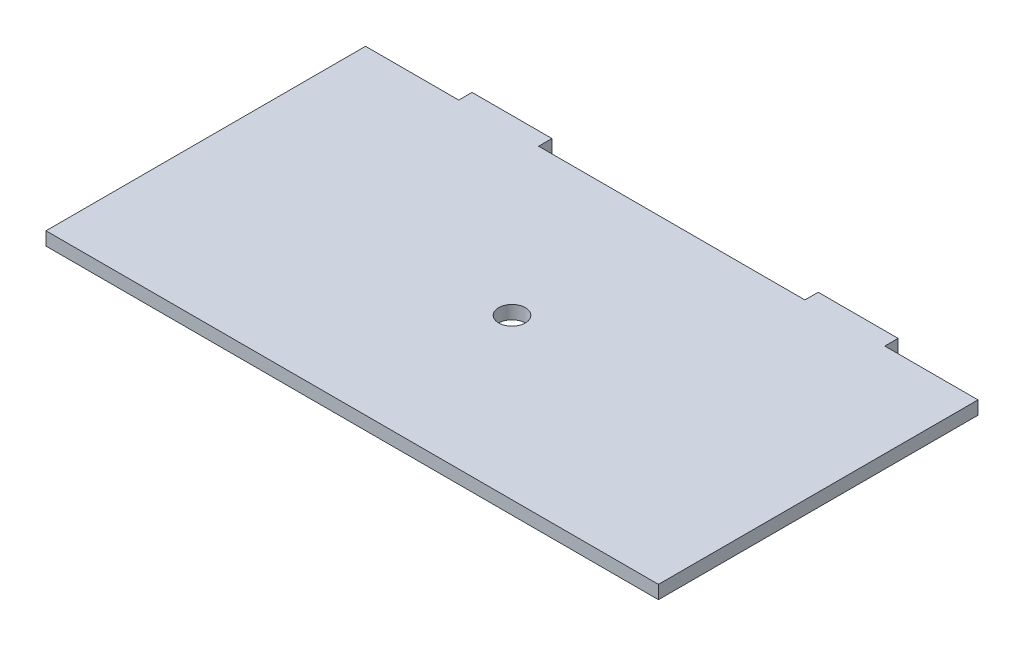
ISO-10303-21;
HEADER;
FILE_DESCRIPTION(('STEP AP214'),'2;1');
FILE_NAME('part.step','',(''),(''),'','','');
FILE_SCHEMA(('AUTOMOTIVE_DESIGN { 1 0 10303 214 1 1 1 1 }'));
ENDSEC;
DATA;
#1=APPLICATION_CONTEXT('core data for automotive mechanical design processes');
#2=APPLICATION_PROTOCOL_DEFINITION('international standard','automotive_design',2000,#1);
#3=PRODUCT_CONTEXT('',#1,'mechanical');
#4=PRODUCT('Part','Part','',(#3));
#5=PRODUCT_RELATED_PRODUCT_CATEGORY('part','',(#4));
#6=PRODUCT_DEFINITION_FORMATION('','',#4);
#7=PRODUCT_DEFINITION_CONTEXT('part definition',#1,'design');
#8=PRODUCT_DEFINITION('design','',#6,#7);
#9=PRODUCT_DEFINITION_SHAPE('','',#8);
#10=(LENGTH_UNIT() NAMED_UNIT(*) SI_UNIT(.MILLI.,.METRE.));
#11=(NAMED_UNIT(*) PLANE_ANGLE_UNIT() SI_UNIT($,.RADIAN.));
#12=(NAMED_UNIT(*) SI_UNIT($,.STERADIAN.) SOLID_ANGLE_UNIT());
#13=UNCERTAINTY_MEASURE_WITH_UNIT(LENGTH_MEASURE(1.E-05),#10,'distance_accuracy_value','');
#14=(GEOMETRIC_REPRESENTATION_CONTEXT(3) GLOBAL_UNCERTAINTY_ASSIGNED_CONTEXT((#13)) GLOBAL_UNIT_ASSIGNED_CONTEXT((#10,
#11,#12)) REPRESENTATION_CONTEXT('',''));
#15=CARTESIAN_POINT('',(0.,0.,0.));
#16=DIRECTION('',(0.,0.,1.));
#17=DIRECTION('',(1.,0.,0.));
#18=AXIS2_PLACEMENT_3D('',#15,#16,#17);
#19=CARTESIAN_POINT('',(0.,3.175,0.));
#20=DIRECTION('',(0.,-1.,0.));
#21=DIRECTION('',(0.,0.,-1.));
#22=AXIS2_PLACEMENT_3D('',#19,#20,#21);
#23=PLANE('',#22);
#24=DIRECTION('',(0.,0.,1.));
#25=VECTOR('',#24,1.);
#26=CARTESIAN_POINT('',(0.,3.175,0.));
#27=LINE('',#26,#25);
#28=CARTESIAN_POINT('',(0.,3.175,-76.2));
#29=VERTEX_POINT('',#28);
#30=CARTESIAN_POINT('',(0.,3.175,0.));
#31=VERTEX_POINT('',#30);
#32=EDGE_CURVE('E177',#29,#31,#27,.T.);
#33=ORIENTED_EDGE('',*,*,#32,.T.);
#34=DIRECTION('',(1.,0.,0.));
#35=VECTOR('',#34,1.);
#36=CARTESIAN_POINT('',(0.,3.175,0.));
#37=LINE('',#36,#35);
#38=CARTESIAN_POINT('',(146.05,3.175,0.));
#39=VERTEX_POINT('',#38);
#40=EDGE_CURVE('E105',#31,#39,#37,.T.);
#41=ORIENTED_EDGE('',*,*,#40,.T.);
#42=DIRECTION('',(0.,0.,-1.));
#43=VECTOR('',#42,1.);
#44=CARTESIAN_POINT('',(146.05,3.175,0.));
#45=LINE('',#44,#43);
#46=CARTESIAN_POINT('',(146.05,3.175,-76.2));
#47=VERTEX_POINT('',#46);
#48=EDGE_CURVE('E204',#39,#47,#45,.T.);
#49=ORIENTED_EDGE('',*,*,#48,.T.);
#50=DIRECTION('',(-1.,0.,0.));
#51=VECTOR('',#50,1.);
#52=CARTESIAN_POINT('',(123.825,3.175,-76.2));
#53=LINE('',#52,#51);
#54=CARTESIAN_POINT('',(123.825,3.175,-76.2));
#55=VERTEX_POINT('',#54);
#56=EDGE_CURVE('E223',#47,#55,#53,.T.);
#57=ORIENTED_EDGE('',*,*,#56,.T.);
#58=DIRECTION('',(0.,0.,-1.));
#59=VECTOR('',#58,1.);
#60=CARTESIAN_POINT('',(123.825,3.175,-76.2));
#61=LINE('',#60,#59);
#62=CARTESIAN_POINT('',(123.825,3.175,-79.375));
#63=VERTEX_POINT('',#62);
#64=EDGE_CURVE('E220',#55,#63,#61,.T.);
#65=ORIENTED_EDGE('',*,*,#64,.T.);
#66=DIRECTION('',(-1.,0.,0.));
#67=VECTOR('',#66,1.);
#68=CARTESIAN_POINT('',(104.775,3.175,-79.375));
#69=LINE('',#68,#67);
#70=CARTESIAN_POINT('',(104.775,3.175,-79.375));
#71=VERTEX_POINT('',#70);
#72=EDGE_CURVE('E222',#63,#71,#69,.T.);
#73=ORIENTED_EDGE('',*,*,#72,.T.);
#74=DIRECTION('',(0.,0.,1.));
#75=VECTOR('',#74,1.);
#76=CARTESIAN_POINT('',(104.775,3.175,-76.2));
#77=LINE('',#76,#75);
#78=CARTESIAN_POINT('',(104.775,3.175,-76.2));
#79=VERTEX_POINT('',#78);
#80=EDGE_CURVE('E225',#71,#79,#77,.T.);
#81=ORIENTED_EDGE('',*,*,#80,.T.);
#82=DIRECTION('',(-1.,0.,0.));
#83=VECTOR('',#82,1.);
#84=CARTESIAN_POINT('',(41.275,3.175,-76.2));
#85=LINE('',#84,#83);
#86=CARTESIAN_POINT('',(41.275,3.175,-76.2));
#87=VERTEX_POINT('',#86);
#88=EDGE_CURVE('E231',#79,#87,#85,.T.);
#89=ORIENTED_EDGE('',*,*,#88,.T.);
#90=DIRECTION('',(0.,0.,-1.));
#91=VECTOR('',#90,1.);
#92=CARTESIAN_POINT('',(41.275,3.175,-76.2));
#93=LINE('',#92,#91);
#94=CARTESIAN_POINT('',(41.275,3.175,-79.375));
#95=VERTEX_POINT('',#94);
#96=EDGE_CURVE('E136',#87,#95,#93,.T.);
#97=ORIENTED_EDGE('',*,*,#96,.T.);
#98=DIRECTION('',(-1.,0.,0.));
#99=VECTOR('',#98,1.);
#100=CARTESIAN_POINT('',(22.225,3.175,-79.375));
#101=LINE('',#100,#99);
#102=CARTESIAN_POINT('',(22.225,3.175,-79.375));
#103=VERTEX_POINT('',#102);
#104=EDGE_CURVE('E130',#95,#103,#101,.T.);
#105=ORIENTED_EDGE('',*,*,#104,.T.);
#106=DIRECTION('',(0.,0.,1.));
#107=VECTOR('',#106,1.);
#108=CARTESIAN_POINT('',(22.225,3.175,-76.2));
#109=LINE('',#108,#107);
#110=CARTESIAN_POINT('',(22.225,3.175,-76.2));
#111=VERTEX_POINT('',#110);
#112=EDGE_CURVE('E134',#103,#111,#109,.T.);
#113=ORIENTED_EDGE('',*,*,#112,.T.);
#114=DIRECTION('',(-1.,0.,0.));
#115=VECTOR('',#114,1.);
#116=CARTESIAN_POINT('',(0.,3.175,-76.2));
#117=LINE('',#116,#115);
#118=EDGE_CURVE('E50',#111,#29,#117,.T.);
#119=ORIENTED_EDGE('',*,*,#118,.T.);
#120=EDGE_LOOP('',(#33,#41,#49,#57,#65,#73,#81,#89,#97,#105,#113,#119));
#121=FACE_BOUND('',#120,.T.);
#122=CARTESIAN_POINT('',(73.025,3.175,-38.1));
#123=DIRECTION('',(0.,1.,0.));
#124=DIRECTION('',(0.,0.,1.));
#125=AXIS2_PLACEMENT_3D('',#122,#123,#124);
#126=CIRCLE('',#125,3.175);
#127=CARTESIAN_POINT('',(73.025,3.175,-34.925));
#128=VERTEX_POINT('',#127);
#129=EDGE_CURVE('E158',#128,#128,#126,.T.);
#130=ORIENTED_EDGE('',*,*,#129,.F.);
#131=EDGE_LOOP('',(#130));
#132=FACE_BOUND('',#131,.T.);
#133=ADVANCED_FACE('F33',(#121,#132),#23,.F.);
#134=CARTESIAN_POINT('',(0.,0.,0.));
#135=DIRECTION('',(0.,-1.,0.));
#136=DIRECTION('',(0.,0.,-1.));
#137=AXIS2_PLACEMENT_3D('',#134,#135,#136);
#138=PLANE('',#137);
#139=DIRECTION('',(0.,0.,1.));
#140=VECTOR('',#139,1.);
#141=CARTESIAN_POINT('',(0.,0.,0.));
#142=LINE('',#141,#140);
#143=CARTESIAN_POINT('',(0.,0.,-76.2));
#144=VERTEX_POINT('',#143);
#145=CARTESIAN_POINT('',(0.,0.,0.));
#146=VERTEX_POINT('',#145);
#147=EDGE_CURVE('E154',#144,#146,#142,.T.);
#148=ORIENTED_EDGE('',*,*,#147,.F.);
#149=DIRECTION('',(-1.,0.,0.));
#150=VECTOR('',#149,1.);
#151=CARTESIAN_POINT('',(0.,0.,-76.2));
#152=LINE('',#151,#150);
#153=CARTESIAN_POINT('',(22.225,0.,-76.2));
#154=VERTEX_POINT('',#153);
#155=EDGE_CURVE('E97',#154,#144,#152,.T.);
#156=ORIENTED_EDGE('',*,*,#155,.F.);
#157=DIRECTION('',(0.,0.,1.));
#158=VECTOR('',#157,1.);
#159=CARTESIAN_POINT('',(22.225,0.,-76.2));
#160=LINE('',#159,#158);
#161=CARTESIAN_POINT('',(22.225,0.,-79.375));
#162=VERTEX_POINT('',#161);
#163=EDGE_CURVE('E91',#162,#154,#160,.T.);
#164=ORIENTED_EDGE('',*,*,#163,.F.);
#165=DIRECTION('',(-1.,0.,0.));
#166=VECTOR('',#165,1.);
#167=CARTESIAN_POINT('',(22.225,0.,-79.375));
#168=LINE('',#167,#166);
#169=CARTESIAN_POINT('',(41.275,0.,-79.375));
#170=VERTEX_POINT('',#169);
#171=EDGE_CURVE('E144',#170,#162,#168,.T.);
#172=ORIENTED_EDGE('',*,*,#171,.F.);
#173=DIRECTION('',(0.,0.,-1.));
#174=VECTOR('',#173,1.);
#175=CARTESIAN_POINT('',(41.275,0.,-76.2));
#176=LINE('',#175,#174);
#177=CARTESIAN_POINT('',(41.275,0.,-76.2));
#178=VERTEX_POINT('',#177);
#179=EDGE_CURVE('E172',#178,#170,#176,.T.);
#180=ORIENTED_EDGE('',*,*,#179,.F.);
#181=DIRECTION('',(-1.,0.,0.));
#182=VECTOR('',#181,1.);
#183=CARTESIAN_POINT('',(41.275,0.,-76.2));
#184=LINE('',#183,#182);
#185=CARTESIAN_POINT('',(104.775,0.,-76.2));
#186=VERTEX_POINT('',#185);
#187=EDGE_CURVE('E170',#186,#178,#184,.T.);
#188=ORIENTED_EDGE('',*,*,#187,.F.);
#189=DIRECTION('',(0.,0.,1.));
#190=VECTOR('',#189,1.);
#191=CARTESIAN_POINT('',(104.775,0.,-76.2));
#192=LINE('',#191,#190);
#193=CARTESIAN_POINT('',(104.775,0.,-79.375));
#194=VERTEX_POINT('',#193);
#195=EDGE_CURVE('E168',#194,#186,#192,.T.);
#196=ORIENTED_EDGE('',*,*,#195,.F.);
#197=DIRECTION('',(-1.,0.,0.));
#198=VECTOR('',#197,1.);
#199=CARTESIAN_POINT('',(104.775,0.,-79.375));
#200=LINE('',#199,#198);
#201=CARTESIAN_POINT('',(123.825,0.,-79.375));
#202=VERTEX_POINT('',#201);
#203=EDGE_CURVE('E166',#202,#194,#200,.T.);
#204=ORIENTED_EDGE('',*,*,#203,.F.);
#205=DIRECTION('',(0.,0.,-1.));
#206=VECTOR('',#205,1.);
#207=CARTESIAN_POINT('',(123.825,0.,-76.2));
#208=LINE('',#207,#206);
#209=CARTESIAN_POINT('',(123.825,0.,-76.2));
#210=VERTEX_POINT('',#209);
#211=EDGE_CURVE('E164',#210,#202,#208,.T.);
#212=ORIENTED_EDGE('',*,*,#211,.F.);
#213=DIRECTION('',(-1.,0.,0.));
#214=VECTOR('',#213,1.);
#215=CARTESIAN_POINT('',(123.825,0.,-76.2));
#216=LINE('',#215,#214);
#217=CARTESIAN_POINT('',(146.05,0.,-76.2));
#218=VERTEX_POINT('',#217);
#219=EDGE_CURVE('E162',#218,#210,#216,.T.);
#220=ORIENTED_EDGE('',*,*,#219,.F.);
#221=DIRECTION('',(0.,0.,-1.));
#222=VECTOR('',#221,1.);
#223=CARTESIAN_POINT('',(146.05,0.,0.));
#224=LINE('',#223,#222);
#225=CARTESIAN_POINT('',(146.05,0.,0.));
#226=VERTEX_POINT('',#225);
#227=EDGE_CURVE('E160',#226,#218,#224,.T.);
#228=ORIENTED_EDGE('',*,*,#227,.F.);
#229=DIRECTION('',(1.,0.,0.));
#230=VECTOR('',#229,1.);
#231=CARTESIAN_POINT('',(0.,0.,0.));
#232=LINE('',#231,#230);
#233=EDGE_CURVE('E157',#146,#226,#232,.T.);
#234=ORIENTED_EDGE('',*,*,#233,.F.);
#235=EDGE_LOOP('',(#148,#156,#164,#172,#180,#188,#196,#204,#212,#220,#228,#234));
#236=FACE_BOUND('',#235,.T.);
#237=CARTESIAN_POINT('',(73.025,0.,-38.1));
#238=DIRECTION('',(0.,1.,0.));
#239=DIRECTION('',(0.,0.,1.));
#240=AXIS2_PLACEMENT_3D('',#237,#238,#239);
#241=CIRCLE('',#240,3.175);
#242=CARTESIAN_POINT('',(73.025,0.,-34.925));
#243=VERTEX_POINT('',#242);
#244=EDGE_CURVE('E378',#243,#243,#241,.T.);
#245=ORIENTED_EDGE('',*,*,#244,.T.);
#246=EDGE_LOOP('',(#245));
#247=FACE_BOUND('',#246,.T.);
#248=ADVANCED_FACE('F208',(#236,#247),#138,.T.);
#249=CARTESIAN_POINT('',(0.,3.175,0.));
#250=DIRECTION('',(1.,0.,0.));
#251=DIRECTION('',(0.,0.,-1.));
#252=AXIS2_PLACEMENT_3D('',#249,#250,#251);
#253=PLANE('',#252);
#254=ORIENTED_EDGE('',*,*,#147,.T.);
#255=DIRECTION('',(0.,-1.,0.));
#256=VECTOR('',#255,1.);
#257=CARTESIAN_POINT('',(0.,3.175,0.));
#258=LINE('',#257,#256);
#259=EDGE_CURVE('E11',#31,#146,#258,.T.);
#260=ORIENTED_EDGE('',*,*,#259,.F.);
#261=ORIENTED_EDGE('',*,*,#32,.F.);
#262=DIRECTION('',(0.,-1.,0.));
#263=VECTOR('',#262,1.);
#264=CARTESIAN_POINT('',(0.,3.175,-76.2));
#265=LINE('',#264,#263);
#266=EDGE_CURVE('E150',#29,#144,#265,.T.);
#267=ORIENTED_EDGE('',*,*,#266,.T.);
#268=EDGE_LOOP('',(#254,#260,#261,#267));
#269=FACE_BOUND('',#268,.T.);
#270=ADVANCED_FACE('F35',(#269),#253,.F.);
#271=CARTESIAN_POINT('',(0.,3.175,0.));
#272=DIRECTION('',(0.,0.,-1.));
#273=DIRECTION('',(-1.,0.,0.));
#274=AXIS2_PLACEMENT_3D('',#271,#272,#273);
#275=PLANE('',#274);
#276=ORIENTED_EDGE('',*,*,#233,.T.);
#277=DIRECTION('',(0.,-1.,0.));
#278=VECTOR('',#277,1.);
#279=CARTESIAN_POINT('',(146.05,3.175,0.));
#280=LINE('',#279,#278);
#281=EDGE_CURVE('E42',#39,#226,#280,.T.);
#282=ORIENTED_EDGE('',*,*,#281,.F.);
#283=ORIENTED_EDGE('',*,*,#40,.F.);
#284=ORIENTED_EDGE('',*,*,#259,.T.);
#285=EDGE_LOOP('',(#276,#282,#283,#284));
#286=FACE_BOUND('',#285,.T.);
#287=ADVANCED_FACE('F265',(#286),#275,.F.);
#288=CARTESIAN_POINT('',(146.05,3.175,0.));
#289=DIRECTION('',(-1.,0.,0.));
#290=DIRECTION('',(0.,0.,1.));
#291=AXIS2_PLACEMENT_3D('',#288,#289,#290);
#292=PLANE('',#291);
#293=ORIENTED_EDGE('',*,*,#227,.T.);
#294=DIRECTION('',(0.,-1.,0.));
#295=VECTOR('',#294,1.);
#296=CARTESIAN_POINT('',(146.05,3.175,-76.2));
#297=LINE('',#296,#295);
#298=EDGE_CURVE('E196',#47,#218,#297,.T.);
#299=ORIENTED_EDGE('',*,*,#298,.F.);
#300=ORIENTED_EDGE('',*,*,#48,.F.);
#301=ORIENTED_EDGE('',*,*,#281,.T.);
#302=EDGE_LOOP('',(#293,#299,#300,#301));
#303=FACE_BOUND('',#302,.T.);
#304=ADVANCED_FACE('F202',(#303),#292,.F.);
#305=CARTESIAN_POINT('',(123.825,3.175,-76.2));
#306=DIRECTION('',(0.,0.,1.));
#307=DIRECTION('',(1.,0.,0.));
#308=AXIS2_PLACEMENT_3D('',#305,#306,#307);
#309=PLANE('',#308);
#310=ORIENTED_EDGE('',*,*,#219,.T.);
#311=DIRECTION('',(0.,-1.,0.));
#312=VECTOR('',#311,1.);
#313=CARTESIAN_POINT('',(123.825,3.175,-76.2));
#314=LINE('',#313,#312);
#315=EDGE_CURVE('E193',#55,#210,#314,.T.);
#316=ORIENTED_EDGE('',*,*,#315,.F.);
#317=ORIENTED_EDGE('',*,*,#56,.F.);
#318=ORIENTED_EDGE('',*,*,#298,.T.);
#319=EDGE_LOOP('',(#310,#316,#317,#318));
#320=FACE_BOUND('',#319,.T.);
#321=ADVANCED_FACE('F214',(#320),#309,.F.);
#322=CARTESIAN_POINT('',(123.825,3.175,-76.2));
#323=DIRECTION('',(-1.,0.,0.));
#324=DIRECTION('',(0.,0.,1.));
#325=AXIS2_PLACEMENT_3D('',#322,#323,#324);
#326=PLANE('',#325);
#327=ORIENTED_EDGE('',*,*,#211,.T.);
#328=DIRECTION('',(0.,-1.,0.));
#329=VECTOR('',#328,1.);
#330=CARTESIAN_POINT('',(123.825,3.175,-79.375));
#331=LINE('',#330,#329);
#332=EDGE_CURVE('E190',#63,#202,#331,.T.);
#333=ORIENTED_EDGE('',*,*,#332,.F.);
#334=ORIENTED_EDGE('',*,*,#64,.F.);
#335=ORIENTED_EDGE('',*,*,#315,.T.);
#336=EDGE_LOOP('',(#327,#333,#334,#335));
#337=FACE_BOUND('',#336,.T.);
#338=ADVANCED_FACE('F218',(#337),#326,.F.);
#339=CARTESIAN_POINT('',(104.775,3.175,-79.375));
#340=DIRECTION('',(0.,0.,1.));
#341=DIRECTION('',(1.,0.,0.));
#342=AXIS2_PLACEMENT_3D('',#339,#340,#341);
#343=PLANE('',#342);
#344=ORIENTED_EDGE('',*,*,#203,.T.);
#345=DIRECTION('',(0.,-1.,0.));
#346=VECTOR('',#345,1.);
#347=CARTESIAN_POINT('',(104.775,3.175,-79.375));
#348=LINE('',#347,#346);
#349=EDGE_CURVE('E187',#71,#194,#348,.T.);
#350=ORIENTED_EDGE('',*,*,#349,.F.);
#351=ORIENTED_EDGE('',*,*,#72,.F.);
#352=ORIENTED_EDGE('',*,*,#332,.T.);
#353=EDGE_LOOP('',(#344,#350,#351,#352));
#354=FACE_BOUND('',#353,.T.);
#355=ADVANCED_FACE('F278',(#354),#343,.F.);
#356=CARTESIAN_POINT('',(104.775,3.175,-76.2));
#357=DIRECTION('',(1.,0.,0.));
#358=DIRECTION('',(0.,0.,-1.));
#359=AXIS2_PLACEMENT_3D('',#356,#357,#358);
#360=PLANE('',#359);
#361=ORIENTED_EDGE('',*,*,#195,.T.);
#362=DIRECTION('',(0.,-1.,0.));
#363=VECTOR('',#362,1.);
#364=CARTESIAN_POINT('',(104.775,3.175,-76.2));
#365=LINE('',#364,#363);
#366=EDGE_CURVE('E184',#79,#186,#365,.T.);
#367=ORIENTED_EDGE('',*,*,#366,.F.);
#368=ORIENTED_EDGE('',*,*,#80,.F.);
#369=ORIENTED_EDGE('',*,*,#349,.T.);
#370=EDGE_LOOP('',(#361,#367,#368,#369));
#371=FACE_BOUND('',#370,.T.);
#372=ADVANCED_FACE('F281',(#371),#360,.F.);
#373=CARTESIAN_POINT('',(41.275,3.175,-76.2));
#374=DIRECTION('',(0.,0.,1.));
#375=DIRECTION('',(1.,0.,0.));
#376=AXIS2_PLACEMENT_3D('',#373,#374,#375);
#377=PLANE('',#376);
#378=ORIENTED_EDGE('',*,*,#187,.T.);
#379=DIRECTION('',(0.,-1.,0.));
#380=VECTOR('',#379,1.);
#381=CARTESIAN_POINT('',(41.275,3.175,-76.2));
#382=LINE('',#381,#380);
#383=EDGE_CURVE('E181',#87,#178,#382,.T.);
#384=ORIENTED_EDGE('',*,*,#383,.F.);
#385=ORIENTED_EDGE('',*,*,#88,.F.);
#386=ORIENTED_EDGE('',*,*,#366,.T.);
#387=EDGE_LOOP('',(#378,#384,#385,#386));
#388=FACE_BOUND('',#387,.T.);
#389=ADVANCED_FACE('F237',(#388),#377,.F.);
#390=CARTESIAN_POINT('',(41.275,3.175,-76.2));
#391=DIRECTION('',(-1.,0.,0.));
#392=DIRECTION('',(0.,0.,1.));
#393=AXIS2_PLACEMENT_3D('',#390,#391,#392);
#394=PLANE('',#393);
#395=ORIENTED_EDGE('',*,*,#179,.T.);
#396=DIRECTION('',(0.,-1.,0.));
#397=VECTOR('',#396,1.);
#398=CARTESIAN_POINT('',(41.275,3.175,-79.375));
#399=LINE('',#398,#397);
#400=EDGE_CURVE('E145',#95,#170,#399,.T.);
#401=ORIENTED_EDGE('',*,*,#400,.F.);
#402=ORIENTED_EDGE('',*,*,#96,.F.);
#403=ORIENTED_EDGE('',*,*,#383,.T.);
#404=EDGE_LOOP('',(#395,#401,#402,#403));
#405=FACE_BOUND('',#404,.T.);
#406=ADVANCED_FACE('F241',(#405),#394,.F.);
#407=CARTESIAN_POINT('',(22.225,3.175,-79.375));
#408=DIRECTION('',(0.,0.,1.));
#409=DIRECTION('',(1.,0.,0.));
#410=AXIS2_PLACEMENT_3D('',#407,#408,#409);
#411=PLANE('',#410);
#412=ORIENTED_EDGE('',*,*,#171,.T.);
#413=DIRECTION('',(0.,-1.,0.));
#414=VECTOR('',#413,1.);
#415=CARTESIAN_POINT('',(22.225,3.175,-79.375));
#416=LINE('',#415,#414);
#417=EDGE_CURVE('E141',#103,#162,#416,.T.);
#418=ORIENTED_EDGE('',*,*,#417,.F.);
#419=ORIENTED_EDGE('',*,*,#104,.F.);
#420=ORIENTED_EDGE('',*,*,#400,.T.);
#421=EDGE_LOOP('',(#412,#418,#419,#420));
#422=FACE_BOUND('',#421,.T.);
#423=ADVANCED_FACE('F142',(#422),#411,.F.);
#424=CARTESIAN_POINT('',(22.225,3.175,-76.2));
#425=DIRECTION('',(1.,0.,0.));
#426=DIRECTION('',(0.,0.,-1.));
#427=AXIS2_PLACEMENT_3D('',#424,#425,#426);
#428=PLANE('',#427);
#429=ORIENTED_EDGE('',*,*,#163,.T.);
#430=DIRECTION('',(0.,-1.,0.));
#431=VECTOR('',#430,1.);
#432=CARTESIAN_POINT('',(22.225,3.175,-76.2));
#433=LINE('',#432,#431);
#434=EDGE_CURVE('E146',#111,#154,#433,.T.);
#435=ORIENTED_EDGE('',*,*,#434,.F.);
#436=ORIENTED_EDGE('',*,*,#112,.F.);
#437=ORIENTED_EDGE('',*,*,#417,.T.);
#438=EDGE_LOOP('',(#429,#435,#436,#437));
#439=FACE_BOUND('',#438,.T.);
#440=ADVANCED_FACE('F148',(#439),#428,.F.);
#441=CARTESIAN_POINT('',(0.,3.175,-76.2));
#442=DIRECTION('',(0.,0.,1.));
#443=DIRECTION('',(1.,0.,0.));
#444=AXIS2_PLACEMENT_3D('',#441,#442,#443);
#445=PLANE('',#444);
#446=ORIENTED_EDGE('',*,*,#155,.T.);
#447=ORIENTED_EDGE('',*,*,#266,.F.);
#448=ORIENTED_EDGE('',*,*,#118,.F.);
#449=ORIENTED_EDGE('',*,*,#434,.T.);
#450=EDGE_LOOP('',(#446,#447,#448,#449));
#451=FACE_BOUND('',#450,.T.);
#452=ADVANCED_FACE('F245',(#451),#445,.F.);
#453=CARTESIAN_POINT('',(73.025,3.175,-38.1));
#454=DIRECTION('',(0.,-1.,0.));
#455=DIRECTION('',(0.,0.,-1.));
#456=AXIS2_PLACEMENT_3D('',#453,#454,#455);
#457=CYLINDRICAL_SURFACE('',#456,3.175);
#458=ORIENTED_EDGE('',*,*,#129,.T.);
#459=EDGE_LOOP('',(#458));
#460=FACE_BOUND('',#459,.T.);
#461=ORIENTED_EDGE('',*,*,#244,.F.);
#462=EDGE_LOOP('',(#461));
#463=FACE_BOUND('',#462,.T.);
#464=ADVANCED_FACE('F247',(#460,#463),#457,.F.);
#465=CLOSED_SHELL('',(#133,#248,#270,#287,#304,#321,#338,#355,#372,#389,#406,#423,#440,#452,#464));
#466=MANIFOLD_SOLID_BREP('B2',#465);
#467=ADVANCED_BREP_SHAPE_REPRESENTATION('',(#18,#466),#14);
#468=SHAPE_DEFINITION_REPRESENTATION(#9,#467);
ENDSEC;
END-ISO-10303-21;
